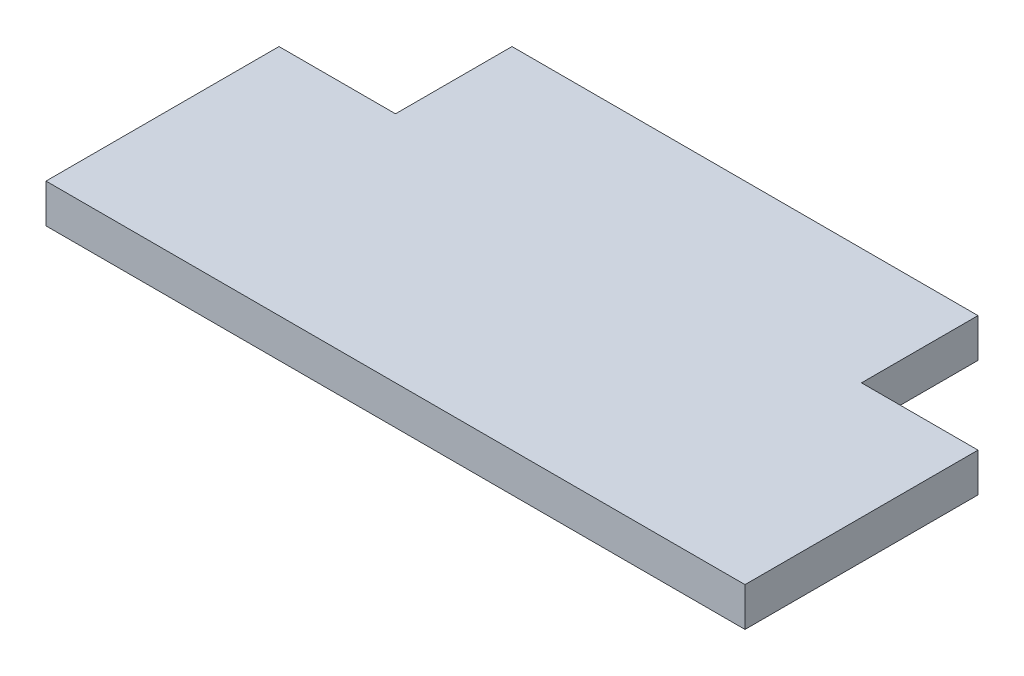
ISO-10303-21;
HEADER;
FILE_DESCRIPTION(('STEP AP214'),'2;1');
FILE_NAME('part.step','',(''),(''),'','','');
FILE_SCHEMA(('AUTOMOTIVE_DESIGN { 1 0 10303 214 1 1 1 1 }'));
ENDSEC;
DATA;
#1=APPLICATION_CONTEXT('core data for automotive mechanical design processes');
#2=APPLICATION_PROTOCOL_DEFINITION('international standard','automotive_design',2000,#1);
#3=PRODUCT_CONTEXT('',#1,'mechanical');
#4=PRODUCT('Part','Part','',(#3));
#5=PRODUCT_RELATED_PRODUCT_CATEGORY('part','',(#4));
#6=PRODUCT_DEFINITION_FORMATION('','',#4);
#7=PRODUCT_DEFINITION_CONTEXT('part definition',#1,'design');
#8=PRODUCT_DEFINITION('design','',#6,#7);
#9=PRODUCT_DEFINITION_SHAPE('','',#8);
#10=(LENGTH_UNIT() NAMED_UNIT(*) SI_UNIT(.MILLI.,.METRE.));
#11=(NAMED_UNIT(*) PLANE_ANGLE_UNIT() SI_UNIT($,.RADIAN.));
#12=(NAMED_UNIT(*) SI_UNIT($,.STERADIAN.) SOLID_ANGLE_UNIT());
#13=UNCERTAINTY_MEASURE_WITH_UNIT(LENGTH_MEASURE(1.E-05),#10,'distance_accuracy_value','');
#14=(GEOMETRIC_REPRESENTATION_CONTEXT(3) GLOBAL_UNCERTAINTY_ASSIGNED_CONTEXT((#13)) GLOBAL_UNIT_ASSIGNED_CONTEXT((#10,
#11,#12)) REPRESENTATION_CONTEXT('',''));
#15=CARTESIAN_POINT('',(0.,0.,0.));
#16=DIRECTION('',(0.,0.,1.));
#17=DIRECTION('',(1.,0.,0.));
#18=AXIS2_PLACEMENT_3D('',#15,#16,#17);
#19=CARTESIAN_POINT('',(0.,101.6,304.8));
#20=DIRECTION('',(0.,0.,1.));
#21=DIRECTION('',(1.,0.,0.));
#22=AXIS2_PLACEMENT_3D('',#19,#20,#21);
#23=PLANE('',#22);
#24=DIRECTION('',(-1.,0.,0.));
#25=VECTOR('',#24,1.);
#26=CARTESIAN_POINT('',(0.,0.,304.8));
#27=LINE('',#26,#25);
#28=CARTESIAN_POINT('',(914.4,0.,304.8));
#29=VERTEX_POINT('',#28);
#30=CARTESIAN_POINT('',(-914.4,0.,304.8));
#31=VERTEX_POINT('',#30);
#32=EDGE_CURVE('E192',#29,#31,#27,.T.);
#33=ORIENTED_EDGE('',*,*,#32,.F.);
#34=DIRECTION('',(0.,-1.,0.));
#35=VECTOR('',#34,1.);
#36=CARTESIAN_POINT('',(914.4,101.6,304.8));
#37=LINE('',#36,#35);
#38=CARTESIAN_POINT('',(914.4,101.6,304.8));
#39=VERTEX_POINT('',#38);
#40=EDGE_CURVE('E136',#39,#29,#37,.T.);
#41=ORIENTED_EDGE('',*,*,#40,.F.);
#42=DIRECTION('',(-1.,0.,0.));
#43=VECTOR('',#42,1.);
#44=CARTESIAN_POINT('',(0.,101.6,304.8));
#45=LINE('',#44,#43);
#46=CARTESIAN_POINT('',(-914.4,101.6,304.8));
#47=VERTEX_POINT('',#46);
#48=EDGE_CURVE('E174',#39,#47,#45,.T.);
#49=ORIENTED_EDGE('',*,*,#48,.T.);
#50=DIRECTION('',(0.,-1.,0.));
#51=VECTOR('',#50,1.);
#52=CARTESIAN_POINT('',(-914.4,101.6,304.8));
#53=LINE('',#52,#51);
#54=EDGE_CURVE('E132',#47,#31,#53,.T.);
#55=ORIENTED_EDGE('',*,*,#54,.T.);
#56=EDGE_LOOP('',(#33,#41,#49,#55));
#57=FACE_BOUND('',#56,.T.);
#58=ADVANCED_FACE('F69',(#57),#23,.T.);
#59=CARTESIAN_POINT('',(914.4,101.6,1.66533453693773E-13));
#60=DIRECTION('',(-1.,0.,0.));
#61=DIRECTION('',(0.,0.,1.));
#62=AXIS2_PLACEMENT_3D('',#59,#60,#61);
#63=PLANE('',#62);
#64=DIRECTION('',(0.,0.,-1.));
#65=VECTOR('',#64,1.);
#66=CARTESIAN_POINT('',(914.4,0.,1.66533453693773E-13));
#67=LINE('',#66,#65);
#68=CARTESIAN_POINT('',(914.4,0.,-304.8));
#69=VERTEX_POINT('',#68);
#70=EDGE_CURVE('E176',#29,#69,#67,.T.);
#71=ORIENTED_EDGE('',*,*,#70,.T.);
#72=DIRECTION('',(0.,-1.,0.));
#73=VECTOR('',#72,1.);
#74=CARTESIAN_POINT('',(914.4,101.6,-304.8));
#75=LINE('',#74,#73);
#76=CARTESIAN_POINT('',(914.4,101.6,-304.8));
#77=VERTEX_POINT('',#76);
#78=EDGE_CURVE('E144',#77,#69,#75,.T.);
#79=ORIENTED_EDGE('',*,*,#78,.F.);
#80=DIRECTION('',(0.,0.,-1.));
#81=VECTOR('',#80,1.);
#82=CARTESIAN_POINT('',(914.4,101.6,1.66533453693773E-13));
#83=LINE('',#82,#81);
#84=EDGE_CURVE('E188',#39,#77,#83,.T.);
#85=ORIENTED_EDGE('',*,*,#84,.F.);
#86=ORIENTED_EDGE('',*,*,#40,.T.);
#87=EDGE_LOOP('',(#71,#79,#85,#86));
#88=FACE_BOUND('',#87,.T.);
#89=ADVANCED_FACE('F196',(#88),#63,.F.);
#90=CARTESIAN_POINT('',(-914.4,101.6,0.));
#91=DIRECTION('',(-1.,0.,0.));
#92=DIRECTION('',(0.,0.,1.));
#93=AXIS2_PLACEMENT_3D('',#90,#91,#92);
#94=PLANE('',#93);
#95=DIRECTION('',(0.,0.,-1.));
#96=VECTOR('',#95,1.);
#97=CARTESIAN_POINT('',(-914.4,0.,0.));
#98=LINE('',#97,#96);
#99=CARTESIAN_POINT('',(-914.4,0.,-304.8));
#100=VERTEX_POINT('',#99);
#101=EDGE_CURVE('E114',#31,#100,#98,.T.);
#102=ORIENTED_EDGE('',*,*,#101,.F.);
#103=ORIENTED_EDGE('',*,*,#54,.F.);
#104=DIRECTION('',(0.,0.,-1.));
#105=VECTOR('',#104,1.);
#106=CARTESIAN_POINT('',(-914.4,101.6,0.));
#107=LINE('',#106,#105);
#108=CARTESIAN_POINT('',(-914.4,101.6,-304.8));
#109=VERTEX_POINT('',#108);
#110=EDGE_CURVE('E171',#47,#109,#107,.T.);
#111=ORIENTED_EDGE('',*,*,#110,.T.);
#112=DIRECTION('',(0.,-1.,0.));
#113=VECTOR('',#112,1.);
#114=CARTESIAN_POINT('',(-914.4,101.6,-304.8));
#115=LINE('',#114,#113);
#116=EDGE_CURVE('E180',#109,#100,#115,.T.);
#117=ORIENTED_EDGE('',*,*,#116,.T.);
#118=EDGE_LOOP('',(#102,#103,#111,#117));
#119=FACE_BOUND('',#118,.T.);
#120=ADVANCED_FACE('F208',(#119),#94,.T.);
#121=CARTESIAN_POINT('',(0.,0.,0.));
#122=DIRECTION('',(0.,1.,0.));
#123=DIRECTION('',(0.,0.,1.));
#124=AXIS2_PLACEMENT_3D('',#121,#122,#123);
#125=PLANE('',#124);
#126=ORIENTED_EDGE('',*,*,#101,.T.);
#127=DIRECTION('',(-1.,0.,0.));
#128=VECTOR('',#127,1.);
#129=CARTESIAN_POINT('',(0.,0.,-304.8));
#130=LINE('',#129,#128);
#131=CARTESIAN_POINT('',(-609.6,0.,-304.8));
#132=VERTEX_POINT('',#131);
#133=EDGE_CURVE('E125',#132,#100,#130,.T.);
#134=ORIENTED_EDGE('',*,*,#133,.F.);
#135=DIRECTION('',(0.,0.,-1.));
#136=VECTOR('',#135,1.);
#137=CARTESIAN_POINT('',(-609.6,0.,-304.8));
#138=LINE('',#137,#136);
#139=CARTESIAN_POINT('',(-609.6,0.,-609.6));
#140=VERTEX_POINT('',#139);
#141=EDGE_CURVE('E110',#132,#140,#138,.T.);
#142=ORIENTED_EDGE('',*,*,#141,.T.);
#143=DIRECTION('',(1.,0.,0.));
#144=VECTOR('',#143,1.);
#145=CARTESIAN_POINT('',(-609.6,0.,-609.6));
#146=LINE('',#145,#144);
#147=CARTESIAN_POINT('',(609.6,0.,-609.6));
#148=VERTEX_POINT('',#147);
#149=EDGE_CURVE('E117',#140,#148,#146,.T.);
#150=ORIENTED_EDGE('',*,*,#149,.T.);
#151=DIRECTION('',(0.,0.,-1.));
#152=VECTOR('',#151,1.);
#153=CARTESIAN_POINT('',(609.6,0.,-304.8));
#154=LINE('',#153,#152);
#155=CARTESIAN_POINT('',(609.6,0.,-304.8));
#156=VERTEX_POINT('',#155);
#157=EDGE_CURVE('E120',#156,#148,#154,.T.);
#158=ORIENTED_EDGE('',*,*,#157,.F.);
#159=EDGE_CURVE('E164',#69,#156,#130,.T.);
#160=ORIENTED_EDGE('',*,*,#159,.F.);
#161=ORIENTED_EDGE('',*,*,#70,.F.);
#162=ORIENTED_EDGE('',*,*,#32,.T.);
#163=EDGE_LOOP('',(#126,#134,#142,#150,#158,#160,#161,#162));
#164=FACE_BOUND('',#163,.T.);
#165=ADVANCED_FACE('F123',(#164),#125,.F.);
#166=CARTESIAN_POINT('',(0.,101.6,0.));
#167=DIRECTION('',(0.,1.,0.));
#168=DIRECTION('',(0.,0.,1.));
#169=AXIS2_PLACEMENT_3D('',#166,#167,#168);
#170=PLANE('',#169);
#171=ORIENTED_EDGE('',*,*,#110,.F.);
#172=ORIENTED_EDGE('',*,*,#48,.F.);
#173=ORIENTED_EDGE('',*,*,#84,.T.);
#174=DIRECTION('',(-1.,0.,0.));
#175=VECTOR('',#174,1.);
#176=CARTESIAN_POINT('',(0.,101.6,-304.8));
#177=LINE('',#176,#175);
#178=CARTESIAN_POINT('',(609.6,101.6,-304.8));
#179=VERTEX_POINT('',#178);
#180=EDGE_CURVE('E156',#77,#179,#177,.T.);
#181=ORIENTED_EDGE('',*,*,#180,.T.);
#182=DIRECTION('',(0.,0.,-1.));
#183=VECTOR('',#182,1.);
#184=CARTESIAN_POINT('',(609.6,101.6,-304.8));
#185=LINE('',#184,#183);
#186=CARTESIAN_POINT('',(609.6,101.6,-609.6));
#187=VERTEX_POINT('',#186);
#188=EDGE_CURVE('E128',#179,#187,#185,.T.);
#189=ORIENTED_EDGE('',*,*,#188,.T.);
#190=DIRECTION('',(1.,0.,0.));
#191=VECTOR('',#190,1.);
#192=CARTESIAN_POINT('',(-609.6,101.6,-609.6));
#193=LINE('',#192,#191);
#194=CARTESIAN_POINT('',(-609.6,101.6,-609.6));
#195=VERTEX_POINT('',#194);
#196=EDGE_CURVE('E126',#195,#187,#193,.T.);
#197=ORIENTED_EDGE('',*,*,#196,.F.);
#198=DIRECTION('',(0.,0.,-1.));
#199=VECTOR('',#198,1.);
#200=CARTESIAN_POINT('',(-609.6,101.6,-304.8));
#201=LINE('',#200,#199);
#202=CARTESIAN_POINT('',(-609.6,101.6,-304.8));
#203=VERTEX_POINT('',#202);
#204=EDGE_CURVE('E112',#203,#195,#201,.T.);
#205=ORIENTED_EDGE('',*,*,#204,.F.);
#206=EDGE_CURVE('E185',#203,#109,#177,.T.);
#207=ORIENTED_EDGE('',*,*,#206,.T.);
#208=EDGE_LOOP('',(#171,#172,#173,#181,#189,#197,#205,#207));
#209=FACE_BOUND('',#208,.T.);
#210=ADVANCED_FACE('F153',(#209),#170,.T.);
#211=CARTESIAN_POINT('',(0.,101.6,-304.8));
#212=DIRECTION('',(0.,0.,1.));
#213=DIRECTION('',(1.,0.,0.));
#214=AXIS2_PLACEMENT_3D('',#211,#212,#213);
#215=PLANE('',#214);
#216=ORIENTED_EDGE('',*,*,#206,.F.);
#217=DIRECTION('',(0.,-1.,0.));
#218=VECTOR('',#217,1.);
#219=CARTESIAN_POINT('',(-609.6,101.6,-304.8));
#220=LINE('',#219,#218);
#221=EDGE_CURVE('E79',#203,#132,#220,.T.);
#222=ORIENTED_EDGE('',*,*,#221,.T.);
#223=ORIENTED_EDGE('',*,*,#133,.T.);
#224=ORIENTED_EDGE('',*,*,#116,.F.);
#225=EDGE_LOOP('',(#216,#222,#223,#224));
#226=FACE_BOUND('',#225,.T.);
#227=ADVANCED_FACE('F213',(#226),#215,.F.);
#228=DIRECTION('',(0.,-1.,0.));
#229=VECTOR('',#228,1.);
#230=CARTESIAN_POINT('',(609.6,101.6,-304.8));
#231=LINE('',#230,#229);
#232=EDGE_CURVE('E12',#179,#156,#231,.T.);
#233=ORIENTED_EDGE('',*,*,#232,.F.);
#234=ORIENTED_EDGE('',*,*,#180,.F.);
#235=ORIENTED_EDGE('',*,*,#78,.T.);
#236=ORIENTED_EDGE('',*,*,#159,.T.);
#237=EDGE_LOOP('',(#233,#234,#235,#236));
#238=FACE_BOUND('',#237,.T.);
#239=ADVANCED_FACE('F169',(#238),#215,.F.);
#240=CARTESIAN_POINT('',(-609.6,101.6,-609.6));
#241=DIRECTION('',(0.,0.,-1.));
#242=DIRECTION('',(-1.,0.,0.));
#243=AXIS2_PLACEMENT_3D('',#240,#241,#242);
#244=PLANE('',#243);
#245=ORIENTED_EDGE('',*,*,#149,.F.);
#246=DIRECTION('',(0.,-1.,0.));
#247=VECTOR('',#246,1.);
#248=CARTESIAN_POINT('',(-609.6,101.6,-609.6));
#249=LINE('',#248,#247);
#250=EDGE_CURVE('E107',#195,#140,#249,.T.);
#251=ORIENTED_EDGE('',*,*,#250,.F.);
#252=ORIENTED_EDGE('',*,*,#196,.T.);
#253=DIRECTION('',(0.,-1.,0.));
#254=VECTOR('',#253,1.);
#255=CARTESIAN_POINT('',(609.6,101.6,-609.6));
#256=LINE('',#255,#254);
#257=EDGE_CURVE('E73',#187,#148,#256,.T.);
#258=ORIENTED_EDGE('',*,*,#257,.T.);
#259=EDGE_LOOP('',(#245,#251,#252,#258));
#260=FACE_BOUND('',#259,.T.);
#261=ADVANCED_FACE('F71',(#260),#244,.T.);
#262=CARTESIAN_POINT('',(-609.6,101.6,-304.8));
#263=DIRECTION('',(-1.,0.,0.));
#264=DIRECTION('',(0.,0.,1.));
#265=AXIS2_PLACEMENT_3D('',#262,#263,#264);
#266=PLANE('',#265);
#267=ORIENTED_EDGE('',*,*,#141,.F.);
#268=ORIENTED_EDGE('',*,*,#221,.F.);
#269=ORIENTED_EDGE('',*,*,#204,.T.);
#270=ORIENTED_EDGE('',*,*,#250,.T.);
#271=EDGE_LOOP('',(#267,#268,#269,#270));
#272=FACE_BOUND('',#271,.T.);
#273=ADVANCED_FACE('F108',(#272),#266,.T.);
#274=CARTESIAN_POINT('',(609.6,101.6,-304.8));
#275=DIRECTION('',(-1.,0.,0.));
#276=DIRECTION('',(0.,0.,1.));
#277=AXIS2_PLACEMENT_3D('',#274,#275,#276);
#278=PLANE('',#277);
#279=ORIENTED_EDGE('',*,*,#157,.T.);
#280=ORIENTED_EDGE('',*,*,#257,.F.);
#281=ORIENTED_EDGE('',*,*,#188,.F.);
#282=ORIENTED_EDGE('',*,*,#232,.T.);
#283=EDGE_LOOP('',(#279,#280,#281,#282));
#284=FACE_BOUND('',#283,.T.);
#285=ADVANCED_FACE('F158',(#284),#278,.F.);
#286=CLOSED_SHELL('',(#58,#89,#120,#165,#210,#227,#239,#261,#273,#285));
#287=MANIFOLD_SOLID_BREP('B2',#286);
#288=ADVANCED_BREP_SHAPE_REPRESENTATION('',(#18,#287),#14);
#289=SHAPE_DEFINITION_REPRESENTATION(#9,#288);
ENDSEC;
END-ISO-10303-21;
